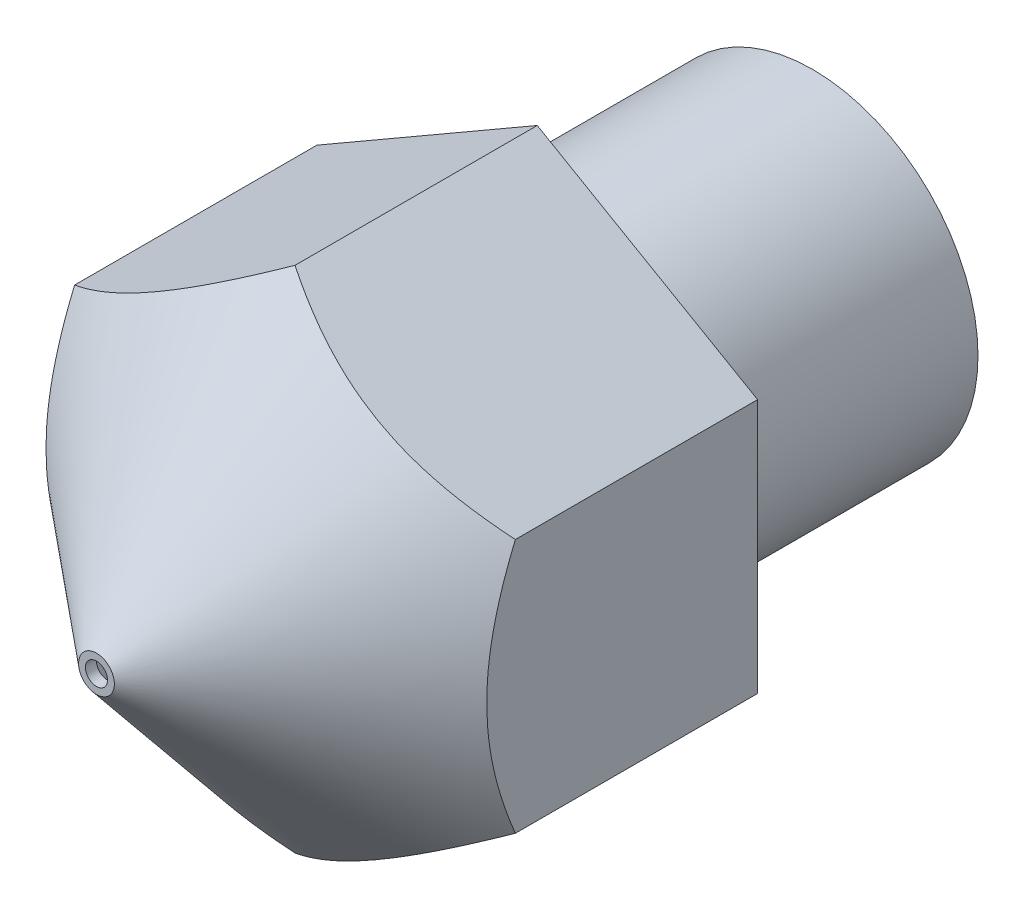
ISO-10303-21;
HEADER;
FILE_DESCRIPTION(('STEP AP214'),'2;1');
FILE_NAME('part.step','',(''),(''),'','','');
FILE_SCHEMA(('AUTOMOTIVE_DESIGN { 1 0 10303 214 1 1 1 1 }'));
ENDSEC;
DATA;
#1=APPLICATION_CONTEXT('core data for automotive mechanical design processes');
#2=APPLICATION_PROTOCOL_DEFINITION('international standard','automotive_design',2000,#1);
#3=PRODUCT_CONTEXT('',#1,'mechanical');
#4=PRODUCT('Part','Part','',(#3));
#5=PRODUCT_RELATED_PRODUCT_CATEGORY('part','',(#4));
#6=PRODUCT_DEFINITION_FORMATION('','',#4);
#7=PRODUCT_DEFINITION_CONTEXT('part definition',#1,'design');
#8=PRODUCT_DEFINITION('design','',#6,#7);
#9=PRODUCT_DEFINITION_SHAPE('','',#8);
#10=(LENGTH_UNIT() NAMED_UNIT(*) SI_UNIT(.MILLI.,.METRE.));
#11=(NAMED_UNIT(*) PLANE_ANGLE_UNIT() SI_UNIT($,.RADIAN.));
#12=(NAMED_UNIT(*) SI_UNIT($,.STERADIAN.) SOLID_ANGLE_UNIT());
#13=UNCERTAINTY_MEASURE_WITH_UNIT(LENGTH_MEASURE(1.E-05),#10,'distance_accuracy_value','');
#14=(GEOMETRIC_REPRESENTATION_CONTEXT(3) GLOBAL_UNCERTAINTY_ASSIGNED_CONTEXT((#13)) GLOBAL_UNIT_ASSIGNED_CONTEXT((#10,
#11,#12)) REPRESENTATION_CONTEXT('',''));
#15=CARTESIAN_POINT('',(0.,0.,0.));
#16=DIRECTION('',(0.,0.,1.));
#17=DIRECTION('',(1.,0.,0.));
#18=AXIS2_PLACEMENT_3D('',#15,#16,#17);
#19=CARTESIAN_POINT('',(0.,0.,8.));
#20=DIRECTION('',(0.,0.,-1.));
#21=DIRECTION('',(-1.,0.,0.));
#22=AXIS2_PLACEMENT_3D('',#19,#20,#21);
#23=CYLINDRICAL_SURFACE('',#22,0.2);
#24=CARTESIAN_POINT('',(0.,0.,8.));
#25=DIRECTION('',(0.,0.,-1.));
#26=DIRECTION('',(-1.,0.,0.));
#27=AXIS2_PLACEMENT_3D('',#24,#25,#26);
#28=CIRCLE('',#27,0.2);
#29=CARTESIAN_POINT('',(-0.2,0.,8.));
#30=VERTEX_POINT('',#29);
#31=EDGE_CURVE('E19',#30,#30,#28,.T.);
#32=ORIENTED_EDGE('',*,*,#31,.F.);
#33=EDGE_LOOP('',(#32));
#34=FACE_BOUND('',#33,.T.);
#35=CARTESIAN_POINT('',(0.,0.,7.80000000003156));
#36=DIRECTION('',(0.,0.,-1.));
#37=DIRECTION('',(-1.,0.,0.));
#38=AXIS2_PLACEMENT_3D('',#35,#36,#37);
#39=CIRCLE('',#38,0.200000000006639);
#40=CARTESIAN_POINT('',(0.,0.199999999949796,7.80000000003156));
#41=VERTEX_POINT('',#40);
#42=EDGE_CURVE('E118',#41,#41,#39,.T.);
#43=ORIENTED_EDGE('',*,*,#42,.T.);
#44=EDGE_LOOP('',(#43));
#45=FACE_BOUND('',#44,.T.);
#46=ADVANCED_FACE('F16',(#34,#45),#23,.F.);
#47=CARTESIAN_POINT('',(0.,0.,8.));
#48=DIRECTION('',(0.,0.,1.));
#49=DIRECTION('',(1.,0.,0.));
#50=AXIS2_PLACEMENT_3D('',#47,#48,#49);
#51=PLANE('',#50);
#52=CARTESIAN_POINT('',(0.,0.,7.99999999998136));
#53=DIRECTION('',(0.,0.,-1.));
#54=DIRECTION('',(0.,1.,0.));
#55=AXIS2_PLACEMENT_3D('',#52,#53,#54);
#56=CIRCLE('',#55,0.325000000032106);
#57=CARTESIAN_POINT('',(0.,0.325000000032105,7.99999999998136));
#58=VERTEX_POINT('',#57);
#59=EDGE_CURVE('E117',#58,#58,#56,.T.);
#60=ORIENTED_EDGE('',*,*,#59,.F.);
#61=EDGE_LOOP('',(#60));
#62=FACE_BOUND('',#61,.T.);
#63=ORIENTED_EDGE('',*,*,#31,.T.);
#64=EDGE_LOOP('',(#63));
#65=FACE_BOUND('',#64,.T.);
#66=ADVANCED_FACE('F224',(#62,#65),#51,.T.);
#67=CARTESIAN_POINT('',(0.,0.,7.00000000011869));
#68=DIRECTION('',(0.,0.,-1.));
#69=DIRECTION('',(0.,1.,0.));
#70=AXIS2_PLACEMENT_3D('',#67,#68,#69);
#71=CONICAL_SURFACE('',#70,0.99999999991951,0.785398163432975);
#72=CARTESIAN_POINT('',(0.,0.,7.00000000000002));
#73=DIRECTION('',(0.,0.,1.));
#74=DIRECTION('',(1.,0.,0.));
#75=AXIS2_PLACEMENT_3D('',#72,#73,#74);
#76=CIRCLE('',#75,1.);
#77=CARTESIAN_POINT('',(0.,1.00000000003817,7.00000000000002));
#78=VERTEX_POINT('',#77);
#79=EDGE_CURVE('E114',#78,#78,#76,.F.);
#80=CARTESIAN_POINT('',(0.,0.199999999949796,7.80000000003156));
#81=CARTESIAN_POINT('',(0.,0.20833333328405,7.7916666666979));
#82=CARTESIAN_POINT('',(0.,0.216666666618304,7.78333333336424));
#83=CARTESIAN_POINT('',(0.,0.233333333286812,7.76666666669691));
#84=CARTESIAN_POINT('',(0.,0.241666666621066,7.75833333336325));
#85=CARTESIAN_POINT('',(0.,0.258333333289573,7.74166666669593));
#86=CARTESIAN_POINT('',(0.,0.266666666623827,7.73333333336226));
#87=CARTESIAN_POINT('',(0.,0.283333333292335,7.71666666669494));
#88=CARTESIAN_POINT('',(0.,0.291666666626589,7.70833333336128));
#89=CARTESIAN_POINT('',(0.,0.308333333295097,7.69166666669396));
#90=CARTESIAN_POINT('',(0.,0.316666666629351,7.6833333333603));
#91=CARTESIAN_POINT('',(0.,0.333333333297859,7.66666666669297));
#92=CARTESIAN_POINT('',(0.,0.341666666632113,7.65833333335931));
#93=CARTESIAN_POINT('',(0.,0.35833333330062,7.64166666669199));
#94=CARTESIAN_POINT('',(0.,0.366666666634875,7.63333333335832));
#95=CARTESIAN_POINT('',(0.,0.383333333303382,7.616666666691));
#96=CARTESIAN_POINT('',(0.,0.391666666637636,7.60833333335734));
#97=CARTESIAN_POINT('',(0.,0.408333333306144,7.59166666669001));
#98=CARTESIAN_POINT('',(0.,0.416666666640398,7.58333333335635));
#99=CARTESIAN_POINT('',(0.,0.433333333308906,7.56666666668903));
#100=CARTESIAN_POINT('',(0.,0.44166666664316,7.55833333335537));
#101=CARTESIAN_POINT('',(0.,0.458333333311668,7.54166666668804));
#102=CARTESIAN_POINT('',(0.,0.466666666645922,7.53333333335438));
#103=CARTESIAN_POINT('',(0.,0.48333333331443,7.51666666668706));
#104=CARTESIAN_POINT('',(0.,0.491666666648684,7.5083333333534));
#105=CARTESIAN_POINT('',(0.,0.508333333317191,7.49166666668607));
#106=CARTESIAN_POINT('',(0.,0.516666666651445,7.48333333335241));
#107=CARTESIAN_POINT('',(0.,0.533333333319953,7.46666666668509));
#108=CARTESIAN_POINT('',(0.,0.541666666654207,7.45833333335143));
#109=CARTESIAN_POINT('',(0.,0.558333333322715,7.4416666666841));
#110=CARTESIAN_POINT('',(0.,0.566666666656969,7.43333333335044));
#111=CARTESIAN_POINT('',(0.,0.583333333325477,7.41666666668312));
#112=CARTESIAN_POINT('',(0.,0.591666666659731,7.40833333334945));
#113=CARTESIAN_POINT('',(0.,0.608333333328239,7.39166666668213));
#114=CARTESIAN_POINT('',(0.,0.616666666662493,7.38333333334847));
#115=CARTESIAN_POINT('',(0.,0.633333333331001,7.36666666668115));
#116=CARTESIAN_POINT('',(0.,0.641666666665255,7.35833333334748));
#117=CARTESIAN_POINT('',(0.,0.658333333333762,7.34166666668016));
#118=CARTESIAN_POINT('',(0.,0.666666666668016,7.3333333333465));
#119=CARTESIAN_POINT('',(0.,0.683333333336524,7.31666666667917));
#120=CARTESIAN_POINT('',(0.,0.691666666670778,7.30833333334551));
#121=CARTESIAN_POINT('',(0.,0.708333333339286,7.29166666667819));
#122=CARTESIAN_POINT('',(0.,0.71666666667354,7.28333333334453));
#123=CARTESIAN_POINT('',(0.,0.733333333342048,7.2666666666772));
#124=CARTESIAN_POINT('',(0.,0.741666666676302,7.25833333334354));
#125=CARTESIAN_POINT('',(0.,0.75833333334481,7.24166666667622));
#126=CARTESIAN_POINT('',(0.,0.766666666679064,7.23333333334256));
#127=CARTESIAN_POINT('',(0.,0.783333333347571,7.21666666667523));
#128=CARTESIAN_POINT('',(0.,0.791666666681825,7.20833333334157));
#129=CARTESIAN_POINT('',(0.,0.808333333350333,7.19166666667425));
#130=CARTESIAN_POINT('',(0.,0.816666666684587,7.18333333334059));
#131=CARTESIAN_POINT('',(0.,0.833333333353095,7.16666666667326));
#132=CARTESIAN_POINT('',(0.,0.841666666687349,7.1583333333396));
#133=CARTESIAN_POINT('',(0.,0.858333333355857,7.14166666667228));
#134=CARTESIAN_POINT('',(0.,0.866666666690111,7.13333333333861));
#135=CARTESIAN_POINT('',(0.,0.883333333358619,7.11666666667129));
#136=CARTESIAN_POINT('',(0.,0.891666666692873,7.10833333333763));
#137=CARTESIAN_POINT('',(0.,0.908333333361381,7.0916666666703));
#138=CARTESIAN_POINT('',(0.,0.916666666695635,7.08333333333664));
#139=CARTESIAN_POINT('',(0.,0.933333333364142,7.06666666666932));
#140=CARTESIAN_POINT('',(0.,0.941666666698396,7.05833333333566));
#141=CARTESIAN_POINT('',(0.,0.958333333366904,7.04166666666833));
#142=CARTESIAN_POINT('',(0.,0.966666666701158,7.03333333333467));
#143=CARTESIAN_POINT('',(0.,0.983333333369666,7.01666666666735));
#144=CARTESIAN_POINT('',(0.,0.99166666670392,7.00833333333369));
#145=CARTESIAN_POINT('',(0.,1.00000000003817,7.00000000000002));
#146=B_SPLINE_CURVE_WITH_KNOTS('',3,(#80,#81,#82,#83,#84,#85,#86,#87,#88,#89,#90,#91,#92,#93,
#94,#95,#96,#97,#98,#99,#100,#101,#102,#103,#104,#105,#106,#107,#108,#109,#110,#111,#112,#113,
#114,#115,#116,#117,#118,#119,#120,#121,#122,#123,#124,#125,#126,#127,#128,#129,#130,#131,#132,
#133,#134,#135,#136,#137,#138,#139,#140,#141,#142,#143,#144,#145),.UNSPECIFIED.,.F.,.F.,(4,2,2,
2,2,2,2,2,2,2,2,2,2,2,2,2,2,2,2,2,2,2,2,2,2,2,2,2,2,2,2,2,4),(0.,0.0353553390619769,
0.0707106781239538,0.106066017185931,0.141421356247908,0.176776695309885,0.212132034371863,
0.247487373433839,0.282842712495816,0.318198051557794,0.353553390619771,0.388908729681748,
0.424264068743725,0.459619407805702,0.494974746867679,0.530330085929657,0.565685424991633,
0.60104076405361,0.636396103115588,0.671751442177565,0.707106781239542,0.742462120301519,
0.777817459363496,0.813172798425473,0.848528137487451,0.883883476549427,0.919238815611404,
0.954594154673382,0.989949493735359,1.02530483279734,1.06066017185931,1.09601551092129,
1.13137084998327),.UNSPECIFIED.);
#147=EDGE_CURVE('BSEAM145',#41,#78,#146,.T.);
#148=ORIENTED_EDGE('',*,*,#42,.F.);
#149=ORIENTED_EDGE('',*,*,#79,.T.);
#150=ORIENTED_EDGE('',*,*,#147,.T.);
#151=ORIENTED_EDGE('',*,*,#147,.F.);
#152=EDGE_LOOP('',(#148,#150,#149,#151));
#153=FACE_BOUND('',#152,.T.);
#154=ADVANCED_FACE('F145',(#153),#71,.F.);
#155=CARTESIAN_POINT('',(0.,0.,4.37545462972366));
#156=DIRECTION('',(0.,0.,-1.));
#157=DIRECTION('',(0.,1.,0.));
#158=AXIS2_PLACEMENT_3D('',#155,#156,#157);
#159=CONICAL_SURFACE('',#158,4.6445649665543,0.872664625996809);
#160=CARTESIAN_POINT('',(-4.00000000000174,-2.30940107675752,4.39707219664051));
#161=CARTESIAN_POINT('',(-3.86535757427452,-2.38713691749547,4.46226639903643));
#162=CARTESIAN_POINT('',(-3.7290756603016,-2.46581931721341,4.52338453097842));
#163=CARTESIAN_POINT('',(-3.45284742233932,-2.6252997647587,4.63511672539355));
#164=CARTESIAN_POINT('',(-3.31289065170507,-2.7061038439593,4.68569609509991));
#165=CARTESIAN_POINT('',(-3.03109750293087,-2.86879719425988,4.77314079290927));
#166=CARTESIAN_POINT('',(-2.88929008488859,-2.95066974523967,4.81012749698159));
#167=CARTESIAN_POINT('',(-2.60341008750732,-3.11572263868367,4.86845394305237));
#168=CARTESIAN_POINT('',(-2.45934049289192,-3.19890125791691,4.88981277981488));
#169=CARTESIAN_POINT('',(-2.16753999577116,-3.36737235347925,4.91538224423549));
#170=CARTESIAN_POINT('',(-2.01978870261199,-3.45267660235781,4.91929212640996));
#171=CARTESIAN_POINT('',(-1.72472666431679,-3.62303074959518,4.90876296570113));
#172=CARTESIAN_POINT('',(-1.57741614231207,-3.70808051912907,4.89431582649066));
#173=CARTESIAN_POINT('',(-1.2848545989127,-3.87699100496522,4.84839118420054));
#174=CARTESIAN_POINT('',(-1.13960358148769,-3.96085171897562,4.81691364829986));
#175=CARTESIAN_POINT('',(-0.852048342125394,-4.12687181382833,4.7393527510913));
#176=CARTESIAN_POINT('',(-0.709745402062845,-4.20903045457991,4.69326317255822));
#177=CARTESIAN_POINT('',(-0.47254895450452,-4.34597588742853,4.60552850463052));
#178=CARTESIAN_POINT('',(-0.376764848422817,-4.40127686685889,4.56701190113196));
#179=CARTESIAN_POINT('',(-0.187077278878999,-4.51079303619694,4.48533676453503));
#180=CARTESIAN_POINT('',(-0.0931683185920342,-4.56501139969794,4.44219530917856));
#181=CARTESIAN_POINT('',(-1.94777778602213E-12,-4.61880215351587,4.39707219664232));
#182=B_SPLINE_CURVE_WITH_KNOTS('',3,(#160,#161,#162,#163,#164,#165,#166,#167,#168,#169,#170,
#171,#172,#173,#174,#175,#176,#177,#178,#179,#180,#181),.UNSPECIFIED.,.F.,.F.,(4,2,2,2,2,2,2,2,
2,2,4),(0.,0.50596009188495,1.01356032942386,1.51651097893163,2.0188460719661,2.52980665066208,
3.04099266573158,3.55217966596372,4.06358446187201,4.4148303050138,4.76482111734096),.UNSPECIFIED.);
#183=CARTESIAN_POINT('',(-3.99999999999999,-2.30940107675953,4.39707219664093));
#184=VERTEX_POINT('',#183);
#185=CARTESIAN_POINT('',(0.,-4.61880215348801,4.39707219664011));
#186=VERTEX_POINT('',#185);
#187=EDGE_CURVE('E158',#184,#186,#182,.T.);
#188=ORIENTED_EDGE('',*,*,#187,.T.);
#189=CARTESIAN_POINT('',(2.00734702281141E-12,-4.61880215351587,4.39707219664231));
#190=CARTESIAN_POINT('',(0.134642425729158,-4.54106631277795,4.4622663990381));
#191=CARTESIAN_POINT('',(0.270924339701999,-4.46238391306006,4.52338453097997));
#192=CARTESIAN_POINT('',(0.547152577664132,-4.30290346551484,4.63511672539484));
#193=CARTESIAN_POINT('',(0.687109348298307,-4.22209938631429,4.68569609510106));
#194=CARTESIAN_POINT('',(0.968902497072338,-4.0594060360138,4.77314079291015));
#195=CARTESIAN_POINT('',(1.11070991511452,-3.97753348503406,4.81012749698233));
#196=CARTESIAN_POINT('',(1.39658991249559,-3.81248059159017,4.86845394305285));
#197=CARTESIAN_POINT('',(1.54065950711088,-3.72930197235699,4.88981277981523));
#198=CARTESIAN_POINT('',(1.83246000423141,-3.56083087679478,4.91538224423561));
#199=CARTESIAN_POINT('',(1.98021129739045,-3.47552662791629,4.91929212640997));
#200=CARTESIAN_POINT('',(2.27527333568539,-3.30517248067906,4.90876296570095));
#201=CARTESIAN_POINT('',(2.42258385768998,-3.22012271114525,4.89431582649041));
#202=CARTESIAN_POINT('',(2.71514540108908,-3.05121222530924,4.84839118420019));
#203=CARTESIAN_POINT('',(2.86039641851396,-2.96735151129892,4.81691364829947));
#204=CARTESIAN_POINT('',(3.147951657876,-2.80133141644636,4.73935275109088));
#205=CARTESIAN_POINT('',(3.29025459793842,-2.71917277569484,4.69326317255779));
#206=CARTESIAN_POINT('',(3.52745104549706,-2.58222734284603,4.60552850462991));
#207=CARTESIAN_POINT('',(3.62323515157921,-2.52692636341542,4.56701190113113));
#208=CARTESIAN_POINT('',(3.81292272112388,-2.41741019407687,4.48533676453374));
#209=CARTESIAN_POINT('',(3.90683168141127,-2.36319183057563,4.44219530917702));
#210=CARTESIAN_POINT('',(4.00000000000177,-2.30940107675746,4.39707219664051));
#211=B_SPLINE_CURVE_WITH_KNOTS('',3,(#189,#190,#191,#192,#193,#194,#195,#196,#197,#198,#199,
#200,#201,#202,#203,#204,#205,#206,#207,#208,#209,#210),.UNSPECIFIED.,.F.,.F.,(4,2,2,2,2,2,2,2,
2,2,4),(0.,0.505960091884584,1.01356032942312,1.51651097893049,2.01884607196456,
2.52980665066009,3.04099266572915,3.55217966596086,4.06358446186874,4.41483030501217,
4.76482111734097),.UNSPECIFIED.);
#212=CARTESIAN_POINT('',(4.0000000000009,-2.30940107675796,4.39707219664093));
#213=VERTEX_POINT('',#212);
#214=EDGE_CURVE('E149',#186,#213,#211,.T.);
#215=ORIENTED_EDGE('',*,*,#214,.T.);
#216=CARTESIAN_POINT('',(4.00000000000002,-2.30940107676048,4.39707219664051));
#217=CARTESIAN_POINT('',(4.00000000000002,-2.15392939528457,4.46226639903643));
#218=CARTESIAN_POINT('',(4.00000000000002,-1.99656459584869,4.52338453097843));
#219=CARTESIAN_POINT('',(4.00000000000002,-1.67760370075809,4.63511672539355));
#220=CARTESIAN_POINT('',(4.00000000000002,-1.51599554235689,4.68569609509992));
#221=CARTESIAN_POINT('',(4.00000000000001,-1.19060884175574,4.77314079290927));
#222=CARTESIAN_POINT('',(4.00000000000001,-1.02686373979615,4.81012749698159));
#223=CARTESIAN_POINT('',(4.00000000000001,-0.696757952908146,4.86845394305237));
#224=CARTESIAN_POINT('',(4.00000000000001,-0.53040071444167,4.88981277981488));
#225=CARTESIAN_POINT('',(4.,-0.193458523317004,4.91538224423549));
#226=CARTESIAN_POINT('',(4.,-0.0228500255598822,4.91929212640996));
#227=CARTESIAN_POINT('',(4.,0.317858268914861,4.90876296570113));
#228=CARTESIAN_POINT('',(4.,0.487957807982641,4.89431582649066));
#229=CARTESIAN_POINT('',(3.99999999999999,0.825778779654957,4.84839118420055));
#230=CARTESIAN_POINT('',(3.99999999999999,0.993500207675752,4.81691364829987));
#231=CARTESIAN_POINT('',(3.99999999999999,1.32554039738117,4.73935275109131));
#232=CARTESIAN_POINT('',(3.99999999999999,1.48985767888435,4.69326317255822));
#233=CARTESIAN_POINT('',(3.99999999999998,1.76374854458235,4.60552850463028));
#234=CARTESIAN_POINT('',(3.99999999999998,1.8743505034438,4.56701190113144));
#235=CARTESIAN_POINT('',(3.99999999999998,2.09338284212135,4.48533676453389));
#236=CARTESIAN_POINT('',(3.99999999999998,2.20181956912405,4.44219530917709));
#237=CARTESIAN_POINT('',(3.99999999999998,2.30940107676062,4.39707219664049));
#238=B_SPLINE_CURVE_WITH_KNOTS('',3,(#216,#217,#218,#219,#220,#221,#222,#223,#224,#225,#226,
#227,#228,#229,#230,#231,#232,#233,#234,#235,#236,#237),.UNSPECIFIED.,.F.,.F.,(4,2,2,2,2,2,2,2,
2,2,4),(0.,0.50596009188496,1.01356032942388,1.51651097893164,2.0188460719661,2.52980665066207,
3.04099266573157,3.55217966596371,4.06358446187201,4.41483030501617,4.76482111734568),.UNSPECIFIED.);
#239=CARTESIAN_POINT('',(3.99999999999998,2.30940107675958,4.39707219664092));
#240=VERTEX_POINT('',#239);
#241=EDGE_CURVE('E130',#213,#240,#238,.T.);
#242=ORIENTED_EDGE('',*,*,#241,.T.);
#243=CARTESIAN_POINT('',(4.00000000000166,2.30940107675758,4.39707219664054));
#244=CARTESIAN_POINT('',(3.86535757427443,2.38713691749554,4.46226639903645));
#245=CARTESIAN_POINT('',(3.72907566030151,2.46581931721348,4.52338453097846));
#246=CARTESIAN_POINT('',(3.45284742233921,2.62529976475879,4.63511672539358));
#247=CARTESIAN_POINT('',(3.31289065170494,2.70610384395939,4.68569609509994));
#248=CARTESIAN_POINT('',(3.03109750293074,2.86879719425997,4.77314079290929));
#249=CARTESIAN_POINT('',(2.88929008488848,2.95066974523975,4.8101274969816));
#250=CARTESIAN_POINT('',(2.60341008750724,3.11572263868374,4.86845394305237));
#251=CARTESIAN_POINT('',(2.45934049289185,3.19890125791697,4.88981277981487));
#252=CARTESIAN_POINT('',(2.16753999577112,3.36737235347929,4.91538224423548));
#253=CARTESIAN_POINT('',(2.01978870261196,3.45267660235785,4.91929212640995));
#254=CARTESIAN_POINT('',(1.72472666431678,3.6230307495952,4.90876296570111));
#255=CARTESIAN_POINT('',(1.57741614231207,3.70808051912909,4.89431582649065));
#256=CARTESIAN_POINT('',(1.2848545989127,3.87699100496524,4.84839118420053));
#257=CARTESIAN_POINT('',(1.13960358148769,3.96085171897564,4.81691364829985));
#258=CARTESIAN_POINT('',(0.85204834212538,4.12687181382835,4.73935275109129));
#259=CARTESIAN_POINT('',(0.709745402062826,4.20903045457994,4.6932631725582));
#260=CARTESIAN_POINT('',(0.472548954501645,4.34597588743021,4.60552850462944));
#261=CARTESIAN_POINT('',(0.37676484841714,4.40127686686219,4.56701190112966));
#262=CARTESIAN_POINT('',(0.187077278867827,4.51079303620341,4.48533676453004));
#263=CARTESIAN_POINT('',(0.0931683185781694,4.56501139970596,4.44219530917211));
#264=CARTESIAN_POINT('',(-1.45671454676676E-11,4.61880215352542,4.3970721966343));
#265=B_SPLINE_CURVE_WITH_KNOTS('',3,(#243,#244,#245,#246,#247,#248,#249,#250,#251,#252,#253,
#254,#255,#256,#257,#258,#259,#260,#261,#262,#263,#264),.UNSPECIFIED.,.F.,.F.,(4,2,2,2,2,2,2,2,
2,2,4),(0.,0.505960091884988,1.01356032942394,1.51651097893165,2.01884607196608,
2.52980665066201,3.04099266573148,3.55217966596363,4.06358446187195,4.4148303050241,
4.76482111736155),.UNSPECIFIED.);
#266=CARTESIAN_POINT('',(0.,4.61880215362982,4.39707219643992));
#267=VERTEX_POINT('',#266);
#268=EDGE_CURVE('E66',#240,#267,#265,.T.);
#269=ORIENTED_EDGE('',*,*,#268,.T.);
#270=CARTESIAN_POINT('',(1.23971543011553E-11,4.61880215353115,4.39707219663739));
#271=CARTESIAN_POINT('',(-0.134642425713778,4.54106631278933,4.4622663990318));
#272=CARTESIAN_POINT('',(-0.270924339686407,4.46238391306971,4.52338453097344));
#273=CARTESIAN_POINT('',(-0.547152577648844,4.30290346552298,4.6351167253889));
#274=CARTESIAN_POINT('',(-0.687109348283537,4.22209938632262,4.68569609509595));
#275=CARTESIAN_POINT('',(-0.968902497058513,4.05940603602195,4.77314079290641));
#276=CARTESIAN_POINT('',(-1.11070991510112,3.97753348504184,4.81012749697914));
#277=CARTESIAN_POINT('',(-1.39658991248313,3.81248059159731,4.86845394305077));
#278=CARTESIAN_POINT('',(-1.54065950709894,3.72930197236387,4.88981277981373));
#279=CARTESIAN_POINT('',(-1.83246000422056,3.56083087680106,4.91538224423513));
#280=CARTESIAN_POINT('',(-1.98021129738019,3.47552662792222,4.91929212640994));
#281=CARTESIAN_POINT('',(-2.27527333567634,3.30517248068429,4.90876296570167));
#282=CARTESIAN_POINT('',(-2.42258385768156,3.22012271115011,4.89431582649143));
#283=CARTESIAN_POINT('',(-2.7151454010819,3.0512122253134,4.84839118420162));
#284=CARTESIAN_POINT('',(-2.86039641850738,2.96735151130273,4.81691364830103));
#285=CARTESIAN_POINT('',(-3.14795165787062,2.80133141644948,4.73935275109253));
#286=CARTESIAN_POINT('',(-3.29025459793363,2.71917277569762,4.69326317255942));
#287=CARTESIAN_POINT('',(-3.52745104549356,2.58222734284807,4.60552850463129));
#288=CARTESIAN_POINT('',(-3.6232351515764,2.52692636341706,4.5670119011323));
#289=CARTESIAN_POINT('',(-3.81292272112246,2.41741019407771,4.48533676453438));
#290=CARTESIAN_POINT('',(-3.90683168141052,2.36319183057608,4.44219530917738));
#291=CARTESIAN_POINT('',(-4.0000000000017,2.30940107675752,4.39707219664054));
#292=B_SPLINE_CURVE_WITH_KNOTS('',3,(#270,#271,#272,#273,#274,#275,#276,#277,#278,#279,#280,
#281,#282,#283,#284,#285,#286,#287,#288,#289,#290,#291),.UNSPECIFIED.,.F.,.F.,(4,2,2,2,2,2,2,2,
2,2,4),(0.,0.505960091886236,1.01356032942656,1.5165109789359,2.01884607197189,2.52980665066948,
3.04099266574062,3.55217966597431,4.06358446188417,4.4148303050301,4.76482111736141),.UNSPECIFIED.);
#293=CARTESIAN_POINT('',(-4.00000000000085,2.30940107675801,4.39707219664095));
#294=VERTEX_POINT('',#293);
#295=EDGE_CURVE('E78',#267,#294,#292,.T.);
#296=ORIENTED_EDGE('',*,*,#295,.T.);
#297=CARTESIAN_POINT('',(-4.00000000000001,2.30940107676058,4.39707219664048));
#298=CARTESIAN_POINT('',(-4.00000000000001,2.15392939528466,4.4622663990364));
#299=CARTESIAN_POINT('',(-4.00000000000001,1.99656459584878,4.5233845309784));
#300=CARTESIAN_POINT('',(-4.00000000000001,1.67760370075817,4.63511672539354));
#301=CARTESIAN_POINT('',(-4.00000000000001,1.51599554235698,4.6856960950999));
#302=CARTESIAN_POINT('',(-4.,1.19060884175582,4.77314079290926));
#303=CARTESIAN_POINT('',(-4.,1.02686373979623,4.81012749698158));
#304=CARTESIAN_POINT('',(-4.,0.696757952908225,4.86845394305236));
#305=CARTESIAN_POINT('',(-4.,0.530400714441747,4.88981277981487));
#306=CARTESIAN_POINT('',(-4.,0.193458523317076,4.91538224423549));
#307=CARTESIAN_POINT('',(-4.,0.0228500255599527,4.91929212640996));
#308=CARTESIAN_POINT('',(-4.,-0.317858268914795,4.90876296570113));
#309=CARTESIAN_POINT('',(-4.,-0.487957807982577,4.89431582649067));
#310=CARTESIAN_POINT('',(-4.,-0.825778779654898,4.84839118420055));
#311=CARTESIAN_POINT('',(-4.,-0.993500207675695,4.81691364829987));
#312=CARTESIAN_POINT('',(-4.,-1.32554039738112,4.73935275109131));
#313=CARTESIAN_POINT('',(-4.,-1.4898576788843,4.69326317255823));
#314=CARTESIAN_POINT('',(-4.,-1.76374854458229,4.60552850463029));
#315=CARTESIAN_POINT('',(-3.99999999999999,-1.87435050344374,4.56701190113145));
#316=CARTESIAN_POINT('',(-3.99999999999999,-2.09338284212128,4.48533676453391));
#317=CARTESIAN_POINT('',(-3.99999999999999,-2.20181956912398,4.44219530917711));
#318=CARTESIAN_POINT('',(-3.99999999999999,-2.30940107676054,4.39707219664051));
#319=B_SPLINE_CURVE_WITH_KNOTS('',3,(#297,#298,#299,#300,#301,#302,#303,#304,#305,#306,#307,
#308,#309,#310,#311,#312,#313,#314,#315,#316,#317,#318),.UNSPECIFIED.,.F.,.F.,(4,2,2,2,2,2,2,2,
2,2,4),(0.,0.505960091884966,1.01356032942389,1.51651097893166,2.01884607196613,2.5298066506621,
3.04099266573161,3.55217966596375,4.06358446187206,4.4148303050162,4.7648211173457),.UNSPECIFIED.);
#320=EDGE_CURVE('E166',#294,#184,#319,.T.);
#321=ORIENTED_EDGE('',*,*,#320,.T.);
#322=EDGE_LOOP('',(#188,#215,#242,#269,#296,#321));
#323=FACE_BOUND('',#322,.T.);
#324=ORIENTED_EDGE('',*,*,#59,.T.);
#325=EDGE_LOOP('',(#324));
#326=FACE_BOUND('',#325,.T.);
#327=ADVANCED_FACE('F139',(#323,#326),#159,.T.);
#328=CARTESIAN_POINT('',(0.,0.,-5.));
#329=DIRECTION('',(0.,0.,1.));
#330=DIRECTION('',(1.,0.,0.));
#331=AXIS2_PLACEMENT_3D('',#328,#329,#330);
#332=CYLINDRICAL_SURFACE('',#331,1.);
#333=CARTESIAN_POINT('',(0.,0.,-5.));
#334=DIRECTION('',(0.,0.,1.));
#335=DIRECTION('',(1.,0.,0.));
#336=AXIS2_PLACEMENT_3D('',#333,#334,#335);
#337=CIRCLE('',#336,1.);
#338=CARTESIAN_POINT('',(1.,0.,-5.));
#339=VERTEX_POINT('',#338);
#340=EDGE_CURVE('E80',#339,#339,#337,.T.);
#341=ORIENTED_EDGE('',*,*,#340,.F.);
#342=EDGE_LOOP('',(#341));
#343=FACE_BOUND('',#342,.T.);
#344=ORIENTED_EDGE('',*,*,#79,.F.);
#345=EDGE_LOOP('',(#344));
#346=FACE_BOUND('',#345,.T.);
#347=ADVANCED_FACE('F144',(#343,#346),#332,.F.);
#348=CARTESIAN_POINT('',(0.,4.61880215351701,8.));
#349=DIRECTION('',(0.500000000000001,-0.866025403784438,0.));
#350=DIRECTION('',(0.866025403784438,0.500000000000001,0.));
#351=AXIS2_PLACEMENT_3D('',#348,#349,#350);
#352=PLANE('',#351);
#353=ORIENTED_EDGE('',*,*,#295,.F.);
#354=DIRECTION('',(0.,0.,1.));
#355=VECTOR('',#354,1.);
#356=CARTESIAN_POINT('',(0.,4.61880215351701,8.));
#357=LINE('',#356,#355);
#358=CARTESIAN_POINT('',(0.,4.61880215351701,0.));
#359=VERTEX_POINT('',#358);
#360=EDGE_CURVE('E71',#267,#359,#357,.F.);
#361=ORIENTED_EDGE('',*,*,#360,.T.);
#362=DIRECTION('',(-0.866025403784438,-0.500000000000001,0.));
#363=VECTOR('',#362,1.);
#364=CARTESIAN_POINT('',(0.,4.61880215351701,0.));
#365=LINE('',#364,#363);
#366=CARTESIAN_POINT('',(-4.,2.30940107675851,0.));
#367=VERTEX_POINT('',#366);
#368=EDGE_CURVE('E76',#359,#367,#365,.T.);
#369=ORIENTED_EDGE('',*,*,#368,.T.);
#370=DIRECTION('',(0.,0.,1.));
#371=VECTOR('',#370,1.);
#372=CARTESIAN_POINT('',(-4.00000000000001,2.3094010767585,8.));
#373=LINE('',#372,#371);
#374=EDGE_CURVE('E177',#367,#294,#373,.T.);
#375=ORIENTED_EDGE('',*,*,#374,.T.);
#376=EDGE_LOOP('',(#353,#361,#369,#375));
#377=FACE_BOUND('',#376,.T.);
#378=ADVANCED_FACE('F73',(#377),#352,.F.);
#379=CARTESIAN_POINT('',(-4.00000000000001,2.3094010767585,8.));
#380=DIRECTION('',(1.,0.,0.));
#381=DIRECTION('',(0.,1.,0.));
#382=AXIS2_PLACEMENT_3D('',#379,#380,#381);
#383=PLANE('',#382);
#384=ORIENTED_EDGE('',*,*,#320,.F.);
#385=ORIENTED_EDGE('',*,*,#374,.F.);
#386=DIRECTION('',(0.,1.,0.));
#387=VECTOR('',#386,1.);
#388=CARTESIAN_POINT('',(-4.00000000000001,0.,0.));
#389=LINE('',#388,#387);
#390=CARTESIAN_POINT('',(-3.99999999999999,-2.30940107675852,0.));
#391=VERTEX_POINT('',#390);
#392=EDGE_CURVE('E91',#367,#391,#389,.F.);
#393=ORIENTED_EDGE('',*,*,#392,.T.);
#394=DIRECTION('',(0.,0.,1.));
#395=VECTOR('',#394,1.);
#396=CARTESIAN_POINT('',(-3.99999999999999,-2.30940107675852,8.));
#397=LINE('',#396,#395);
#398=EDGE_CURVE('E344',#391,#184,#397,.T.);
#399=ORIENTED_EDGE('',*,*,#398,.T.);
#400=EDGE_LOOP('',(#384,#385,#393,#399));
#401=FACE_BOUND('',#400,.T.);
#402=ADVANCED_FACE('F180',(#401),#383,.F.);
#403=CARTESIAN_POINT('',(-3.99999999999999,-2.30940107675852,8.));
#404=DIRECTION('',(0.499999999999995,0.866025403784442,0.));
#405=DIRECTION('',(-0.866025403784442,0.499999999999995,0.));
#406=AXIS2_PLACEMENT_3D('',#403,#404,#405);
#407=PLANE('',#406);
#408=ORIENTED_EDGE('',*,*,#187,.F.);
#409=ORIENTED_EDGE('',*,*,#398,.F.);
#410=DIRECTION('',(0.866025403784442,-0.499999999999995,0.));
#411=VECTOR('',#410,1.);
#412=CARTESIAN_POINT('',(-3.99999999999999,-2.30940107675852,0.));
#413=LINE('',#412,#411);
#414=CARTESIAN_POINT('',(0.,-4.61880215351701,0.));
#415=VERTEX_POINT('',#414);
#416=EDGE_CURVE('E93',#391,#415,#413,.T.);
#417=ORIENTED_EDGE('',*,*,#416,.T.);
#418=DIRECTION('',(0.,0.,1.));
#419=VECTOR('',#418,1.);
#420=CARTESIAN_POINT('',(0.,-4.61880215351701,8.));
#421=LINE('',#420,#419);
#422=EDGE_CURVE('E334',#415,#186,#421,.T.);
#423=ORIENTED_EDGE('',*,*,#422,.T.);
#424=EDGE_LOOP('',(#408,#409,#417,#423));
#425=FACE_BOUND('',#424,.T.);
#426=ADVANCED_FACE('F183',(#425),#407,.F.);
#427=CARTESIAN_POINT('',(0.,-4.61880215351701,8.));
#428=DIRECTION('',(-0.500000000000007,0.866025403784435,0.));
#429=DIRECTION('',(-0.866025403784435,-0.500000000000007,0.));
#430=AXIS2_PLACEMENT_3D('',#427,#428,#429);
#431=PLANE('',#430);
#432=ORIENTED_EDGE('',*,*,#214,.F.);
#433=ORIENTED_EDGE('',*,*,#422,.F.);
#434=DIRECTION('',(0.866025403784435,0.500000000000007,0.));
#435=VECTOR('',#434,1.);
#436=CARTESIAN_POINT('',(0.,-4.61880215351701,0.));
#437=LINE('',#436,#435);
#438=CARTESIAN_POINT('',(4.00000000000002,-2.30940107675847,0.));
#439=VERTEX_POINT('',#438);
#440=EDGE_CURVE('E103',#415,#439,#437,.T.);
#441=ORIENTED_EDGE('',*,*,#440,.T.);
#442=DIRECTION('',(0.,0.,1.));
#443=VECTOR('',#442,1.);
#444=CARTESIAN_POINT('',(4.00000000000002,-2.30940107675847,8.));
#445=LINE('',#444,#443);
#446=EDGE_CURVE('E330',#439,#213,#445,.T.);
#447=ORIENTED_EDGE('',*,*,#446,.T.);
#448=EDGE_LOOP('',(#432,#433,#441,#447));
#449=FACE_BOUND('',#448,.T.);
#450=ADVANCED_FACE('F187',(#449),#431,.F.);
#451=CARTESIAN_POINT('',(4.00000000000002,-2.30940107675847,8.));
#452=DIRECTION('',(-1.,0.,0.));
#453=DIRECTION('',(0.,-1.,0.));
#454=AXIS2_PLACEMENT_3D('',#451,#452,#453);
#455=PLANE('',#454);
#456=ORIENTED_EDGE('',*,*,#241,.F.);
#457=ORIENTED_EDGE('',*,*,#446,.F.);
#458=DIRECTION('',(0.,1.,0.));
#459=VECTOR('',#458,1.);
#460=CARTESIAN_POINT('',(4.00000000000002,0.,0.));
#461=LINE('',#460,#459);
#462=CARTESIAN_POINT('',(3.99999999999997,2.30940107675856,0.));
#463=VERTEX_POINT('',#462);
#464=EDGE_CURVE('E34',#439,#463,#461,.T.);
#465=ORIENTED_EDGE('',*,*,#464,.T.);
#466=DIRECTION('',(0.,0.,1.));
#467=VECTOR('',#466,1.);
#468=CARTESIAN_POINT('',(3.99999999999998,2.30940107675855,8.));
#469=LINE('',#468,#467);
#470=EDGE_CURVE('E85',#463,#240,#469,.T.);
#471=ORIENTED_EDGE('',*,*,#470,.T.);
#472=EDGE_LOOP('',(#456,#457,#465,#471));
#473=FACE_BOUND('',#472,.T.);
#474=ADVANCED_FACE('F191',(#473),#455,.F.);
#475=CARTESIAN_POINT('',(3.99999999999998,2.30940107675855,8.));
#476=DIRECTION('',(-0.499999999999995,-0.866025403784442,0.));
#477=DIRECTION('',(0.866025403784442,-0.499999999999995,0.));
#478=AXIS2_PLACEMENT_3D('',#475,#476,#477);
#479=PLANE('',#478);
#480=ORIENTED_EDGE('',*,*,#268,.F.);
#481=ORIENTED_EDGE('',*,*,#470,.F.);
#482=DIRECTION('',(-0.866025403784442,0.499999999999995,0.));
#483=VECTOR('',#482,1.);
#484=CARTESIAN_POINT('',(3.99999999999998,2.30940107675855,0.));
#485=LINE('',#484,#483);
#486=EDGE_CURVE('E83',#463,#359,#485,.T.);
#487=ORIENTED_EDGE('',*,*,#486,.T.);
#488=ORIENTED_EDGE('',*,*,#360,.F.);
#489=EDGE_LOOP('',(#480,#481,#487,#488));
#490=FACE_BOUND('',#489,.T.);
#491=ADVANCED_FACE('F84',(#490),#479,.F.);
#492=CARTESIAN_POINT('',(0.,0.,-5.));
#493=DIRECTION('',(0.,0.,-1.));
#494=DIRECTION('',(-1.,0.,0.));
#495=AXIS2_PLACEMENT_3D('',#492,#493,#494);
#496=PLANE('',#495);
#497=CARTESIAN_POINT('',(0.,0.,-5.));
#498=DIRECTION('',(0.,0.,1.));
#499=DIRECTION('',(1.,0.,0.));
#500=AXIS2_PLACEMENT_3D('',#497,#498,#499);
#501=CIRCLE('',#500,3.);
#502=CARTESIAN_POINT('',(3.,0.,-5.));
#503=VERTEX_POINT('',#502);
#504=EDGE_CURVE('E25',#503,#503,#501,.T.);
#505=ORIENTED_EDGE('',*,*,#504,.F.);
#506=EDGE_LOOP('',(#505));
#507=FACE_BOUND('',#506,.T.);
#508=ORIENTED_EDGE('',*,*,#340,.T.);
#509=EDGE_LOOP('',(#508));
#510=FACE_BOUND('',#509,.T.);
#511=ADVANCED_FACE('F199',(#507,#510),#496,.T.);
#512=CARTESIAN_POINT('',(0.,0.,0.));
#513=DIRECTION('',(0.,0.,1.));
#514=DIRECTION('',(1.,0.,0.));
#515=AXIS2_PLACEMENT_3D('',#512,#513,#514);
#516=PLANE('',#515);
#517=CARTESIAN_POINT('',(0.,0.,0.));
#518=DIRECTION('',(0.,0.,1.));
#519=DIRECTION('',(1.,0.,0.));
#520=AXIS2_PLACEMENT_3D('',#517,#518,#519);
#521=CIRCLE('',#520,3.);
#522=CARTESIAN_POINT('',(3.,0.,0.));
#523=VERTEX_POINT('',#522);
#524=EDGE_CURVE('E11',#523,#523,#521,.F.);
#525=ORIENTED_EDGE('',*,*,#524,.F.);
#526=EDGE_LOOP('',(#525));
#527=FACE_BOUND('',#526,.T.);
#528=ORIENTED_EDGE('',*,*,#464,.F.);
#529=ORIENTED_EDGE('',*,*,#440,.F.);
#530=ORIENTED_EDGE('',*,*,#416,.F.);
#531=ORIENTED_EDGE('',*,*,#392,.F.);
#532=ORIENTED_EDGE('',*,*,#368,.F.);
#533=ORIENTED_EDGE('',*,*,#486,.F.);
#534=EDGE_LOOP('',(#528,#529,#530,#531,#532,#533));
#535=FACE_BOUND('',#534,.T.);
#536=ADVANCED_FACE('F89',(#527,#535),#516,.F.);
#537=CARTESIAN_POINT('',(0.,0.,-5.));
#538=DIRECTION('',(0.,0.,1.));
#539=DIRECTION('',(1.,0.,0.));
#540=AXIS2_PLACEMENT_3D('',#537,#538,#539);
#541=CYLINDRICAL_SURFACE('',#540,3.);
#542=ORIENTED_EDGE('',*,*,#524,.T.);
#543=EDGE_LOOP('',(#542));
#544=FACE_BOUND('',#543,.T.);
#545=ORIENTED_EDGE('',*,*,#504,.T.);
#546=EDGE_LOOP('',(#545));
#547=FACE_BOUND('',#546,.T.);
#548=ADVANCED_FACE('F201',(#544,#547),#541,.T.);
#549=CLOSED_SHELL('',(#46,#66,#154,#327,#347,#378,#402,#426,#450,#474,#491,#511,#536,#548));
#550=MANIFOLD_SOLID_BREP('B1',#549);
#551=ADVANCED_BREP_SHAPE_REPRESENTATION('',(#18,#550),#14);
#552=SHAPE_DEFINITION_REPRESENTATION(#9,#551);
ENDSEC;
END-ISO-10303-21;
